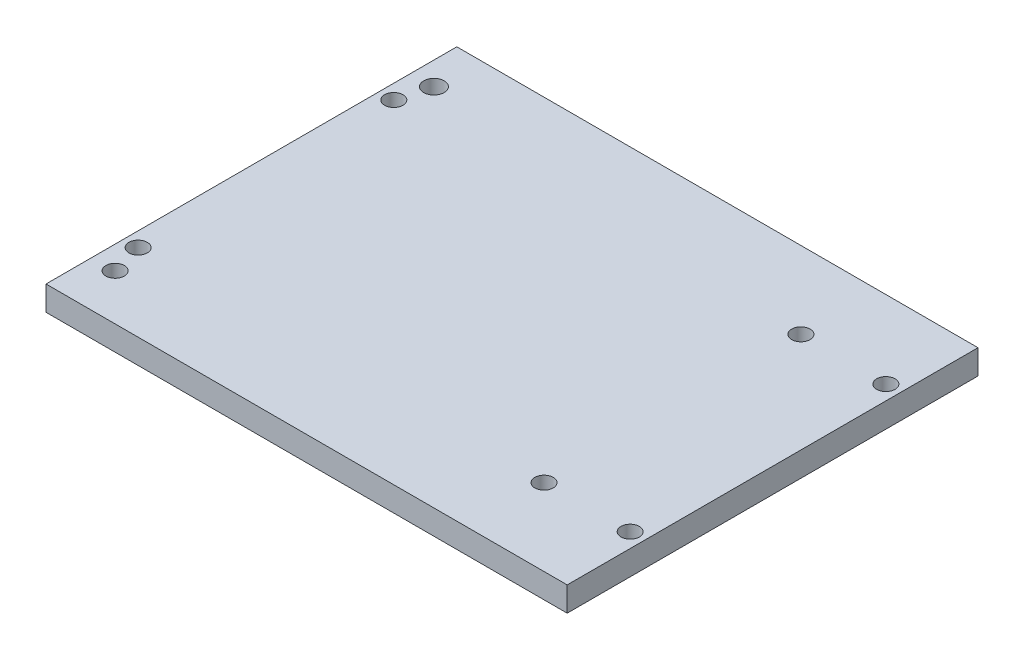
ISO-10303-21;
HEADER;
FILE_DESCRIPTION(('STEP AP214'),'2;1');
FILE_NAME('part.step','',(''),(''),'','','');
FILE_SCHEMA(('AUTOMOTIVE_DESIGN { 1 0 10303 214 1 1 1 1 }'));
ENDSEC;
DATA;
#1=APPLICATION_CONTEXT('core data for automotive mechanical design processes');
#2=APPLICATION_PROTOCOL_DEFINITION('international standard','automotive_design',2000,#1);
#3=PRODUCT_CONTEXT('',#1,'mechanical');
#4=PRODUCT('Part','Part','',(#3));
#5=PRODUCT_RELATED_PRODUCT_CATEGORY('part','',(#4));
#6=PRODUCT_DEFINITION_FORMATION('','',#4);
#7=PRODUCT_DEFINITION_CONTEXT('part definition',#1,'design');
#8=PRODUCT_DEFINITION('design','',#6,#7);
#9=PRODUCT_DEFINITION_SHAPE('','',#8);
#10=(LENGTH_UNIT() NAMED_UNIT(*) SI_UNIT(.MILLI.,.METRE.));
#11=(NAMED_UNIT(*) PLANE_ANGLE_UNIT() SI_UNIT($,.RADIAN.));
#12=(NAMED_UNIT(*) SI_UNIT($,.STERADIAN.) SOLID_ANGLE_UNIT());
#13=UNCERTAINTY_MEASURE_WITH_UNIT(LENGTH_MEASURE(1.E-05),#10,'distance_accuracy_value','');
#14=(GEOMETRIC_REPRESENTATION_CONTEXT(3) GLOBAL_UNCERTAINTY_ASSIGNED_CONTEXT((#13)) GLOBAL_UNIT_ASSIGNED_CONTEXT((#10,
#11,#12)) REPRESENTATION_CONTEXT('',''));
#15=CARTESIAN_POINT('',(0.,0.,0.));
#16=DIRECTION('',(0.,0.,1.));
#17=DIRECTION('',(1.,0.,0.));
#18=AXIS2_PLACEMENT_3D('',#15,#16,#17);
#19=CARTESIAN_POINT('',(42.5,4.,-33.5));
#20=DIRECTION('',(-1.,0.,0.));
#21=DIRECTION('',(0.,0.,1.));
#22=AXIS2_PLACEMENT_3D('',#19,#20,#21);
#23=PLANE('',#22);
#24=DIRECTION('',(0.,0.,-1.));
#25=VECTOR('',#24,1.);
#26=CARTESIAN_POINT('',(42.5,0.,-33.5));
#27=LINE('',#26,#25);
#28=CARTESIAN_POINT('',(42.5,0.,33.5));
#29=VERTEX_POINT('',#28);
#30=CARTESIAN_POINT('',(42.5,0.,-33.5));
#31=VERTEX_POINT('',#30);
#32=EDGE_CURVE('E98',#29,#31,#27,.T.);
#33=ORIENTED_EDGE('',*,*,#32,.T.);
#34=DIRECTION('',(0.,-1.,0.));
#35=VECTOR('',#34,1.);
#36=CARTESIAN_POINT('',(42.5,4.,-33.5));
#37=LINE('',#36,#35);
#38=CARTESIAN_POINT('',(42.5,4.,-33.5));
#39=VERTEX_POINT('',#38);
#40=EDGE_CURVE('E11',#39,#31,#37,.T.);
#41=ORIENTED_EDGE('',*,*,#40,.F.);
#42=DIRECTION('',(0.,0.,-1.));
#43=VECTOR('',#42,1.);
#44=CARTESIAN_POINT('',(42.5,4.,-33.5));
#45=LINE('',#44,#43);
#46=CARTESIAN_POINT('',(42.5,4.,33.5));
#47=VERTEX_POINT('',#46);
#48=EDGE_CURVE('E85',#47,#39,#45,.T.);
#49=ORIENTED_EDGE('',*,*,#48,.F.);
#50=DIRECTION('',(0.,-1.,0.));
#51=VECTOR('',#50,1.);
#52=CARTESIAN_POINT('',(42.5,4.,33.5));
#53=LINE('',#52,#51);
#54=EDGE_CURVE('E94',#47,#29,#53,.T.);
#55=ORIENTED_EDGE('',*,*,#54,.T.);
#56=EDGE_LOOP('',(#33,#41,#49,#55));
#57=FACE_BOUND('',#56,.T.);
#58=ADVANCED_FACE('F32',(#57),#23,.F.);
#59=CARTESIAN_POINT('',(-42.5,4.,-33.5));
#60=DIRECTION('',(0.,0.,1.));
#61=DIRECTION('',(1.,0.,0.));
#62=AXIS2_PLACEMENT_3D('',#59,#60,#61);
#63=PLANE('',#62);
#64=DIRECTION('',(-1.,0.,0.));
#65=VECTOR('',#64,1.);
#66=CARTESIAN_POINT('',(-42.5,0.,-33.5));
#67=LINE('',#66,#65);
#68=CARTESIAN_POINT('',(-42.5,0.,-33.5));
#69=VERTEX_POINT('',#68);
#70=EDGE_CURVE('E89',#31,#69,#67,.T.);
#71=ORIENTED_EDGE('',*,*,#70,.T.);
#72=DIRECTION('',(0.,-1.,0.));
#73=VECTOR('',#72,1.);
#74=CARTESIAN_POINT('',(-42.5,4.,-33.5));
#75=LINE('',#74,#73);
#76=CARTESIAN_POINT('',(-42.5,4.,-33.5));
#77=VERTEX_POINT('',#76);
#78=EDGE_CURVE('E41',#77,#69,#75,.T.);
#79=ORIENTED_EDGE('',*,*,#78,.F.);
#80=DIRECTION('',(-1.,0.,0.));
#81=VECTOR('',#80,1.);
#82=CARTESIAN_POINT('',(-42.5,4.,-33.5));
#83=LINE('',#82,#81);
#84=EDGE_CURVE('E80',#39,#77,#83,.T.);
#85=ORIENTED_EDGE('',*,*,#84,.F.);
#86=ORIENTED_EDGE('',*,*,#40,.T.);
#87=EDGE_LOOP('',(#71,#79,#85,#86));
#88=FACE_BOUND('',#87,.T.);
#89=ADVANCED_FACE('F88',(#88),#63,.F.);
#90=CARTESIAN_POINT('',(-42.5,4.,-33.5));
#91=DIRECTION('',(1.,0.,0.));
#92=DIRECTION('',(0.,0.,-1.));
#93=AXIS2_PLACEMENT_3D('',#90,#91,#92);
#94=PLANE('',#93);
#95=DIRECTION('',(0.,0.,1.));
#96=VECTOR('',#95,1.);
#97=CARTESIAN_POINT('',(-42.5,0.,-33.5));
#98=LINE('',#97,#96);
#99=CARTESIAN_POINT('',(-42.5,0.,33.5));
#100=VERTEX_POINT('',#99);
#101=EDGE_CURVE('E67',#69,#100,#98,.T.);
#102=ORIENTED_EDGE('',*,*,#101,.T.);
#103=DIRECTION('',(0.,-1.,0.));
#104=VECTOR('',#103,1.);
#105=CARTESIAN_POINT('',(-42.5,4.,33.5));
#106=LINE('',#105,#104);
#107=CARTESIAN_POINT('',(-42.5,4.,33.5));
#108=VERTEX_POINT('',#107);
#109=EDGE_CURVE('E90',#108,#100,#106,.T.);
#110=ORIENTED_EDGE('',*,*,#109,.F.);
#111=DIRECTION('',(0.,0.,1.));
#112=VECTOR('',#111,1.);
#113=CARTESIAN_POINT('',(-42.5,4.,-33.5));
#114=LINE('',#113,#112);
#115=EDGE_CURVE('E83',#77,#108,#114,.T.);
#116=ORIENTED_EDGE('',*,*,#115,.F.);
#117=ORIENTED_EDGE('',*,*,#78,.T.);
#118=EDGE_LOOP('',(#102,#110,#116,#117));
#119=FACE_BOUND('',#118,.T.);
#120=ADVANCED_FACE('F92',(#119),#94,.F.);
#121=CARTESIAN_POINT('',(-42.5,4.,33.5));
#122=DIRECTION('',(0.,0.,-1.));
#123=DIRECTION('',(-1.,0.,0.));
#124=AXIS2_PLACEMENT_3D('',#121,#122,#123);
#125=PLANE('',#124);
#126=DIRECTION('',(1.,0.,0.));
#127=VECTOR('',#126,1.);
#128=CARTESIAN_POINT('',(-42.5,0.,33.5));
#129=LINE('',#128,#127);
#130=EDGE_CURVE('E73',#100,#29,#129,.T.);
#131=ORIENTED_EDGE('',*,*,#130,.T.);
#132=ORIENTED_EDGE('',*,*,#54,.F.);
#133=DIRECTION('',(1.,0.,0.));
#134=VECTOR('',#133,1.);
#135=CARTESIAN_POINT('',(-42.5,4.,33.5));
#136=LINE('',#135,#134);
#137=EDGE_CURVE('E50',#108,#47,#136,.T.);
#138=ORIENTED_EDGE('',*,*,#137,.F.);
#139=ORIENTED_EDGE('',*,*,#109,.T.);
#140=EDGE_LOOP('',(#131,#132,#138,#139));
#141=FACE_BOUND('',#140,.T.);
#142=ADVANCED_FACE('F152',(#141),#125,.F.);
#143=CARTESIAN_POINT('',(0.,4.,0.));
#144=DIRECTION('',(0.,1.,0.));
#145=DIRECTION('',(0.,0.,1.));
#146=AXIS2_PLACEMENT_3D('',#143,#144,#145);
#147=PLANE('',#146);
#148=CARTESIAN_POINT('',(-38.73,4.,26.));
#149=DIRECTION('',(0.,1.,0.));
#150=DIRECTION('',(0.,0.,1.));
#151=AXIS2_PLACEMENT_3D('',#148,#149,#150);
#152=CIRCLE('',#151,1.5);
#153=CARTESIAN_POINT('',(-38.73,4.,27.5));
#154=VERTEX_POINT('',#153);
#155=EDGE_CURVE('E275',#154,#154,#152,.T.);
#156=ORIENTED_EDGE('',*,*,#155,.F.);
#157=EDGE_LOOP('',(#156));
#158=FACE_BOUND('',#157,.T.);
#159=CARTESIAN_POINT('',(-38.73,4.,-26.));
#160=DIRECTION('',(0.,1.,0.));
#161=DIRECTION('',(0.,0.,1.));
#162=AXIS2_PLACEMENT_3D('',#159,#160,#161);
#163=CIRCLE('',#162,1.67);
#164=CARTESIAN_POINT('',(-38.73,4.,-24.33));
#165=VERTEX_POINT('',#164);
#166=EDGE_CURVE('E276',#165,#165,#163,.T.);
#167=ORIENTED_EDGE('',*,*,#166,.F.);
#168=EDGE_LOOP('',(#167));
#169=FACE_BOUND('',#168,.T.);
#170=CARTESIAN_POINT('',(26.173152267301,4.,20.95));
#171=DIRECTION('',(0.,1.,0.));
#172=DIRECTION('',(0.,0.,1.));
#173=AXIS2_PLACEMENT_3D('',#170,#171,#172);
#174=CIRCLE('',#173,1.5);
#175=CARTESIAN_POINT('',(26.173152267301,4.,22.45));
#176=VERTEX_POINT('',#175);
#177=EDGE_CURVE('E279',#176,#176,#174,.T.);
#178=ORIENTED_EDGE('',*,*,#177,.F.);
#179=EDGE_LOOP('',(#178));
#180=FACE_BOUND('',#179,.T.);
#181=CARTESIAN_POINT('',(26.173152267301,4.,-20.95));
#182=DIRECTION('',(0.,1.,0.));
#183=DIRECTION('',(0.,0.,1.));
#184=AXIS2_PLACEMENT_3D('',#181,#182,#183);
#185=CIRCLE('',#184,1.5);
#186=CARTESIAN_POINT('',(26.173152267301,4.,-19.45));
#187=VERTEX_POINT('',#186);
#188=EDGE_CURVE('E111',#187,#187,#185,.T.);
#189=ORIENTED_EDGE('',*,*,#188,.F.);
#190=EDGE_LOOP('',(#189));
#191=FACE_BOUND('',#190,.T.);
#192=CARTESIAN_POINT('',(-40.125,4.,20.85));
#193=DIRECTION('',(0.,1.,0.));
#194=DIRECTION('',(0.,0.,1.));
#195=AXIS2_PLACEMENT_3D('',#192,#193,#194);
#196=CIRCLE('',#195,1.5);
#197=CARTESIAN_POINT('',(-40.125,4.,22.35));
#198=VERTEX_POINT('',#197);
#199=EDGE_CURVE('E135',#198,#198,#196,.T.);
#200=ORIENTED_EDGE('',*,*,#199,.F.);
#201=EDGE_LOOP('',(#200));
#202=FACE_BOUND('',#201,.T.);
#203=CARTESIAN_POINT('',(40.125,4.,-20.85));
#204=DIRECTION('',(0.,1.,0.));
#205=DIRECTION('',(0.,0.,1.));
#206=AXIS2_PLACEMENT_3D('',#203,#204,#205);
#207=CIRCLE('',#206,1.5);
#208=CARTESIAN_POINT('',(40.125,4.,-19.35));
#209=VERTEX_POINT('',#208);
#210=EDGE_CURVE('E127',#209,#209,#207,.T.);
#211=ORIENTED_EDGE('',*,*,#210,.F.);
#212=EDGE_LOOP('',(#211));
#213=FACE_BOUND('',#212,.T.);
#214=CARTESIAN_POINT('',(40.125,4.,20.85));
#215=DIRECTION('',(0.,1.,0.));
#216=DIRECTION('',(0.,0.,1.));
#217=AXIS2_PLACEMENT_3D('',#214,#215,#216);
#218=CIRCLE('',#217,1.5);
#219=CARTESIAN_POINT('',(40.125,4.,22.35));
#220=VERTEX_POINT('',#219);
#221=EDGE_CURVE('E118',#220,#220,#218,.T.);
#222=ORIENTED_EDGE('',*,*,#221,.F.);
#223=EDGE_LOOP('',(#222));
#224=FACE_BOUND('',#223,.T.);
#225=CARTESIAN_POINT('',(-40.125,4.,-20.85));
#226=DIRECTION('',(0.,1.,0.));
#227=DIRECTION('',(0.,0.,1.));
#228=AXIS2_PLACEMENT_3D('',#225,#226,#227);
#229=CIRCLE('',#228,1.5);
#230=CARTESIAN_POINT('',(-40.125,4.,-19.35));
#231=VERTEX_POINT('',#230);
#232=EDGE_CURVE('E134',#231,#231,#229,.T.);
#233=ORIENTED_EDGE('',*,*,#232,.F.);
#234=EDGE_LOOP('',(#233));
#235=FACE_BOUND('',#234,.T.);
#236=ORIENTED_EDGE('',*,*,#48,.T.);
#237=ORIENTED_EDGE('',*,*,#84,.T.);
#238=ORIENTED_EDGE('',*,*,#115,.T.);
#239=ORIENTED_EDGE('',*,*,#137,.T.);
#240=EDGE_LOOP('',(#236,#237,#238,#239));
#241=FACE_BOUND('',#240,.T.);
#242=ADVANCED_FACE('F81',(#158,#169,#180,#191,#202,#213,#224,#235,#241),#147,.T.);
#243=CARTESIAN_POINT('',(0.,0.,0.));
#244=DIRECTION('',(0.,1.,0.));
#245=DIRECTION('',(0.,0.,1.));
#246=AXIS2_PLACEMENT_3D('',#243,#244,#245);
#247=PLANE('',#246);
#248=CARTESIAN_POINT('',(-38.73,0.,26.));
#249=DIRECTION('',(0.,1.,0.));
#250=DIRECTION('',(0.,0.,1.));
#251=AXIS2_PLACEMENT_3D('',#248,#249,#250);
#252=CIRCLE('',#251,1.5);
#253=CARTESIAN_POINT('',(-38.73,0.,27.5));
#254=VERTEX_POINT('',#253);
#255=EDGE_CURVE('E35',#254,#254,#252,.T.);
#256=ORIENTED_EDGE('',*,*,#255,.T.);
#257=EDGE_LOOP('',(#256));
#258=FACE_BOUND('',#257,.T.);
#259=CARTESIAN_POINT('',(-38.73,0.,-26.));
#260=DIRECTION('',(0.,1.,0.));
#261=DIRECTION('',(0.,0.,1.));
#262=AXIS2_PLACEMENT_3D('',#259,#260,#261);
#263=CIRCLE('',#262,1.67);
#264=CARTESIAN_POINT('',(-38.73,0.,-24.33));
#265=VERTEX_POINT('',#264);
#266=EDGE_CURVE('E113',#265,#265,#263,.T.);
#267=ORIENTED_EDGE('',*,*,#266,.T.);
#268=EDGE_LOOP('',(#267));
#269=FACE_BOUND('',#268,.T.);
#270=CARTESIAN_POINT('',(26.173152267301,0.,20.95));
#271=DIRECTION('',(0.,1.,0.));
#272=DIRECTION('',(0.,0.,1.));
#273=AXIS2_PLACEMENT_3D('',#270,#271,#272);
#274=CIRCLE('',#273,1.5);
#275=CARTESIAN_POINT('',(26.173152267301,0.,22.45));
#276=VERTEX_POINT('',#275);
#277=EDGE_CURVE('E110',#276,#276,#274,.T.);
#278=ORIENTED_EDGE('',*,*,#277,.T.);
#279=EDGE_LOOP('',(#278));
#280=FACE_BOUND('',#279,.T.);
#281=CARTESIAN_POINT('',(26.173152267301,0.,-20.95));
#282=DIRECTION('',(0.,1.,0.));
#283=DIRECTION('',(0.,0.,1.));
#284=AXIS2_PLACEMENT_3D('',#281,#282,#283);
#285=CIRCLE('',#284,1.5);
#286=CARTESIAN_POINT('',(26.173152267301,0.,-19.45));
#287=VERTEX_POINT('',#286);
#288=EDGE_CURVE('E107',#287,#287,#285,.T.);
#289=ORIENTED_EDGE('',*,*,#288,.T.);
#290=EDGE_LOOP('',(#289));
#291=FACE_BOUND('',#290,.T.);
#292=CARTESIAN_POINT('',(-40.125,0.,20.85));
#293=DIRECTION('',(0.,1.,0.));
#294=DIRECTION('',(0.,0.,1.));
#295=AXIS2_PLACEMENT_3D('',#292,#293,#294);
#296=CIRCLE('',#295,1.5);
#297=CARTESIAN_POINT('',(-40.125,0.,22.35));
#298=VERTEX_POINT('',#297);
#299=EDGE_CURVE('E131',#298,#298,#296,.T.);
#300=ORIENTED_EDGE('',*,*,#299,.T.);
#301=EDGE_LOOP('',(#300));
#302=FACE_BOUND('',#301,.T.);
#303=CARTESIAN_POINT('',(40.125,0.,-20.85));
#304=DIRECTION('',(0.,1.,0.));
#305=DIRECTION('',(0.,0.,1.));
#306=AXIS2_PLACEMENT_3D('',#303,#304,#305);
#307=CIRCLE('',#306,1.5);
#308=CARTESIAN_POINT('',(40.125,0.,-19.35));
#309=VERTEX_POINT('',#308);
#310=EDGE_CURVE('E138',#309,#309,#307,.T.);
#311=ORIENTED_EDGE('',*,*,#310,.T.);
#312=EDGE_LOOP('',(#311));
#313=FACE_BOUND('',#312,.T.);
#314=CARTESIAN_POINT('',(40.125,0.,20.85));
#315=DIRECTION('',(0.,1.,0.));
#316=DIRECTION('',(0.,0.,1.));
#317=AXIS2_PLACEMENT_3D('',#314,#315,#316);
#318=CIRCLE('',#317,1.5);
#319=CARTESIAN_POINT('',(40.125,0.,22.35));
#320=VERTEX_POINT('',#319);
#321=EDGE_CURVE('E122',#320,#320,#318,.T.);
#322=ORIENTED_EDGE('',*,*,#321,.T.);
#323=EDGE_LOOP('',(#322));
#324=FACE_BOUND('',#323,.T.);
#325=CARTESIAN_POINT('',(-40.125,0.,-20.85));
#326=DIRECTION('',(0.,1.,0.));
#327=DIRECTION('',(0.,0.,1.));
#328=AXIS2_PLACEMENT_3D('',#325,#326,#327);
#329=CIRCLE('',#328,1.5);
#330=CARTESIAN_POINT('',(-40.125,0.,-19.35));
#331=VERTEX_POINT('',#330);
#332=EDGE_CURVE('E101',#331,#331,#329,.T.);
#333=ORIENTED_EDGE('',*,*,#332,.T.);
#334=EDGE_LOOP('',(#333));
#335=FACE_BOUND('',#334,.T.);
#336=ORIENTED_EDGE('',*,*,#32,.F.);
#337=ORIENTED_EDGE('',*,*,#130,.F.);
#338=ORIENTED_EDGE('',*,*,#101,.F.);
#339=ORIENTED_EDGE('',*,*,#70,.F.);
#340=EDGE_LOOP('',(#336,#337,#338,#339));
#341=FACE_BOUND('',#340,.T.);
#342=ADVANCED_FACE('F151',(#258,#269,#280,#291,#302,#313,#324,#335,#341),#247,.F.);
#343=CARTESIAN_POINT('',(-40.125,0.,-20.85));
#344=DIRECTION('',(0.,1.,0.));
#345=DIRECTION('',(0.,0.,1.));
#346=AXIS2_PLACEMENT_3D('',#343,#344,#345);
#347=CYLINDRICAL_SURFACE('',#346,1.5);
#348=ORIENTED_EDGE('',*,*,#332,.F.);
#349=EDGE_LOOP('',(#348));
#350=FACE_BOUND('',#349,.T.);
#351=ORIENTED_EDGE('',*,*,#232,.T.);
#352=EDGE_LOOP('',(#351));
#353=FACE_BOUND('',#352,.T.);
#354=ADVANCED_FACE('F148',(#350,#353),#347,.F.);
#355=CARTESIAN_POINT('',(40.125,0.,20.85));
#356=DIRECTION('',(0.,1.,0.));
#357=DIRECTION('',(0.,0.,1.));
#358=AXIS2_PLACEMENT_3D('',#355,#356,#357);
#359=CYLINDRICAL_SURFACE('',#358,1.5);
#360=ORIENTED_EDGE('',*,*,#321,.F.);
#361=EDGE_LOOP('',(#360));
#362=FACE_BOUND('',#361,.T.);
#363=ORIENTED_EDGE('',*,*,#221,.T.);
#364=EDGE_LOOP('',(#363));
#365=FACE_BOUND('',#364,.T.);
#366=ADVANCED_FACE('F191',(#362,#365),#359,.F.);
#367=CARTESIAN_POINT('',(40.125,0.,-20.85));
#368=DIRECTION('',(0.,1.,0.));
#369=DIRECTION('',(0.,0.,1.));
#370=AXIS2_PLACEMENT_3D('',#367,#368,#369);
#371=CYLINDRICAL_SURFACE('',#370,1.5);
#372=ORIENTED_EDGE('',*,*,#310,.F.);
#373=EDGE_LOOP('',(#372));
#374=FACE_BOUND('',#373,.T.);
#375=ORIENTED_EDGE('',*,*,#210,.T.);
#376=EDGE_LOOP('',(#375));
#377=FACE_BOUND('',#376,.T.);
#378=ADVANCED_FACE('F201',(#374,#377),#371,.F.);
#379=CARTESIAN_POINT('',(-40.125,0.,20.85));
#380=DIRECTION('',(0.,1.,0.));
#381=DIRECTION('',(0.,0.,1.));
#382=AXIS2_PLACEMENT_3D('',#379,#380,#381);
#383=CYLINDRICAL_SURFACE('',#382,1.5);
#384=ORIENTED_EDGE('',*,*,#299,.F.);
#385=EDGE_LOOP('',(#384));
#386=FACE_BOUND('',#385,.T.);
#387=ORIENTED_EDGE('',*,*,#199,.T.);
#388=EDGE_LOOP('',(#387));
#389=FACE_BOUND('',#388,.T.);
#390=ADVANCED_FACE('F211',(#386,#389),#383,.F.);
#391=CARTESIAN_POINT('',(26.173152267301,-6.,-20.95));
#392=DIRECTION('',(0.,1.,0.));
#393=DIRECTION('',(0.,0.,1.));
#394=AXIS2_PLACEMENT_3D('',#391,#392,#393);
#395=CYLINDRICAL_SURFACE('',#394,1.5);
#396=ORIENTED_EDGE('',*,*,#188,.T.);
#397=EDGE_LOOP('',(#396));
#398=FACE_BOUND('',#397,.T.);
#399=ORIENTED_EDGE('',*,*,#288,.F.);
#400=EDGE_LOOP('',(#399));
#401=FACE_BOUND('',#400,.T.);
#402=ADVANCED_FACE('F220',(#398,#401),#395,.F.);
#403=CARTESIAN_POINT('',(26.173152267301,-6.,20.95));
#404=DIRECTION('',(0.,1.,0.));
#405=DIRECTION('',(0.,0.,1.));
#406=AXIS2_PLACEMENT_3D('',#403,#404,#405);
#407=CYLINDRICAL_SURFACE('',#406,1.5);
#408=ORIENTED_EDGE('',*,*,#177,.T.);
#409=EDGE_LOOP('',(#408));
#410=FACE_BOUND('',#409,.T.);
#411=ORIENTED_EDGE('',*,*,#277,.F.);
#412=EDGE_LOOP('',(#411));
#413=FACE_BOUND('',#412,.T.);
#414=ADVANCED_FACE('F239',(#410,#413),#407,.F.);
#415=CARTESIAN_POINT('',(-38.73,-6.,-26.));
#416=DIRECTION('',(0.,1.,0.));
#417=DIRECTION('',(0.,0.,1.));
#418=AXIS2_PLACEMENT_3D('',#415,#416,#417);
#419=CYLINDRICAL_SURFACE('',#418,1.67);
#420=ORIENTED_EDGE('',*,*,#166,.T.);
#421=EDGE_LOOP('',(#420));
#422=FACE_BOUND('',#421,.T.);
#423=ORIENTED_EDGE('',*,*,#266,.F.);
#424=EDGE_LOOP('',(#423));
#425=FACE_BOUND('',#424,.T.);
#426=ADVANCED_FACE('F249',(#422,#425),#419,.F.);
#427=CARTESIAN_POINT('',(-38.73,-6.,26.));
#428=DIRECTION('',(0.,1.,0.));
#429=DIRECTION('',(0.,0.,1.));
#430=AXIS2_PLACEMENT_3D('',#427,#428,#429);
#431=CYLINDRICAL_SURFACE('',#430,1.5);
#432=ORIENTED_EDGE('',*,*,#155,.T.);
#433=EDGE_LOOP('',(#432));
#434=FACE_BOUND('',#433,.T.);
#435=ORIENTED_EDGE('',*,*,#255,.F.);
#436=EDGE_LOOP('',(#435));
#437=FACE_BOUND('',#436,.T.);
#438=ADVANCED_FACE('F259',(#434,#437),#431,.F.);
#439=CLOSED_SHELL('',(#58,#89,#120,#142,#242,#342,#354,#366,#378,#390,#402,#414,#426,#438));
#440=MANIFOLD_SOLID_BREP('B2',#439);
#441=ADVANCED_BREP_SHAPE_REPRESENTATION('',(#18,#440),#14);
#442=SHAPE_DEFINITION_REPRESENTATION(#9,#441);
ENDSEC;
END-ISO-10303-21;
